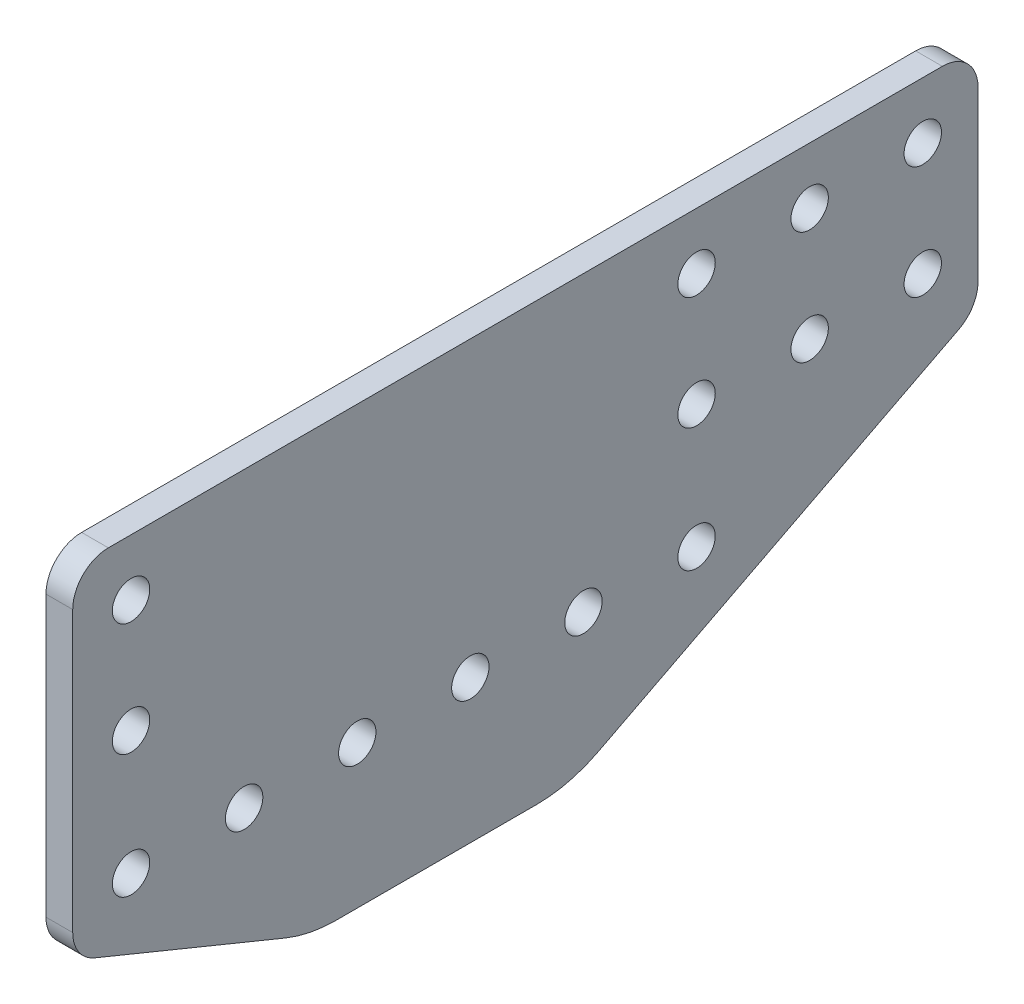
ISO-10303-21;
HEADER;
FILE_DESCRIPTION(('STEP AP214'),'2;1');
FILE_NAME('part.step','',(''),(''),'','','');
FILE_SCHEMA(('AUTOMOTIVE_DESIGN { 1 0 10303 214 1 1 1 1 }'));
ENDSEC;
DATA;
#1=APPLICATION_CONTEXT('core data for automotive mechanical design processes');
#2=APPLICATION_PROTOCOL_DEFINITION('international standard','automotive_design',2000,#1);
#3=PRODUCT_CONTEXT('',#1,'mechanical');
#4=PRODUCT('Part','Part','',(#3));
#5=PRODUCT_RELATED_PRODUCT_CATEGORY('part','',(#4));
#6=PRODUCT_DEFINITION_FORMATION('','',#4);
#7=PRODUCT_DEFINITION_CONTEXT('part definition',#1,'design');
#8=PRODUCT_DEFINITION('design','',#6,#7);
#9=PRODUCT_DEFINITION_SHAPE('','',#8);
#10=(LENGTH_UNIT() NAMED_UNIT(*) SI_UNIT(.MILLI.,.METRE.));
#11=(NAMED_UNIT(*) PLANE_ANGLE_UNIT() SI_UNIT($,.RADIAN.));
#12=(NAMED_UNIT(*) SI_UNIT($,.STERADIAN.) SOLID_ANGLE_UNIT());
#13=UNCERTAINTY_MEASURE_WITH_UNIT(LENGTH_MEASURE(1.E-05),#10,'distance_accuracy_value','');
#14=(GEOMETRIC_REPRESENTATION_CONTEXT(3) GLOBAL_UNCERTAINTY_ASSIGNED_CONTEXT((#13)) GLOBAL_UNIT_ASSIGNED_CONTEXT((#10,
#11,#12)) REPRESENTATION_CONTEXT('',''));
#15=CARTESIAN_POINT('',(0.,0.,0.));
#16=DIRECTION('',(0.,0.,1.));
#17=DIRECTION('',(1.,0.,0.));
#18=AXIS2_PLACEMENT_3D('',#15,#16,#17);
#19=CARTESIAN_POINT('',(3.,44.1852219844326,38.1241040048911));
#20=DIRECTION('',(-1.,0.,0.));
#21=DIRECTION('',(0.,0.,1.));
#22=AXIS2_PLACEMENT_3D('',#19,#20,#21);
#23=CYLINDRICAL_SURFACE('',#22,4.);
#24=CARTESIAN_POINT('',(0.,44.1852219844326,38.1241040048911));
#25=DIRECTION('',(1.,0.,0.));
#26=DIRECTION('',(0.,0.,-1.));
#27=AXIS2_PLACEMENT_3D('',#24,#25,#26);
#28=CIRCLE('',#27,4.);
#29=CARTESIAN_POINT('',(0.,44.1852219844325,42.1241040048911));
#30=VERTEX_POINT('',#29);
#31=CARTESIAN_POINT('',(0.,48.1852219844326,38.1241040048911));
#32=VERTEX_POINT('',#31);
#33=EDGE_CURVE('E202',#30,#32,#28,.F.);
#34=ORIENTED_EDGE('',*,*,#33,.F.);
#35=DIRECTION('',(-1.,0.,0.));
#36=VECTOR('',#35,1.);
#37=CARTESIAN_POINT('',(3.,44.1852219844325,42.1241040048911));
#38=LINE('',#37,#36);
#39=CARTESIAN_POINT('',(3.,44.1852219844325,42.1241040048911));
#40=VERTEX_POINT('',#39);
#41=EDGE_CURVE('E11',#40,#30,#38,.T.);
#42=ORIENTED_EDGE('',*,*,#41,.F.);
#43=CARTESIAN_POINT('',(3.,44.1852219844326,38.1241040048911));
#44=DIRECTION('',(1.,0.,0.));
#45=DIRECTION('',(0.,0.,-1.));
#46=AXIS2_PLACEMENT_3D('',#43,#44,#45);
#47=CIRCLE('',#46,4.);
#48=CARTESIAN_POINT('',(3.,48.1852219844326,38.1241040048911));
#49=VERTEX_POINT('',#48);
#50=EDGE_CURVE('E311',#40,#49,#47,.F.);
#51=ORIENTED_EDGE('',*,*,#50,.T.);
#52=DIRECTION('',(-1.,0.,0.));
#53=VECTOR('',#52,1.);
#54=CARTESIAN_POINT('',(3.,48.1852219844326,38.1241040048911));
#55=LINE('',#54,#53);
#56=EDGE_CURVE('E58',#49,#32,#55,.T.);
#57=ORIENTED_EDGE('',*,*,#56,.T.);
#58=EDGE_LOOP('',(#34,#42,#51,#57));
#59=FACE_BOUND('',#58,.T.);
#60=ADVANCED_FACE('F41',(#59),#23,.T.);
#61=CARTESIAN_POINT('',(3.,0.,42.1241040048911));
#62=DIRECTION('',(0.,0.,1.));
#63=DIRECTION('',(1.,0.,0.));
#64=AXIS2_PLACEMENT_3D('',#61,#62,#63);
#65=PLANE('',#64);
#66=DIRECTION('',(0.,1.,0.));
#67=VECTOR('',#66,1.);
#68=CARTESIAN_POINT('',(0.,0.,42.1241040048911));
#69=LINE('',#68,#67);
#70=CARTESIAN_POINT('',(0.,12.7690313124669,42.1241040048911));
#71=VERTEX_POINT('',#70);
#72=EDGE_CURVE('E204',#71,#30,#69,.T.);
#73=ORIENTED_EDGE('',*,*,#72,.F.);
#74=DIRECTION('',(-1.,0.,0.));
#75=VECTOR('',#74,1.);
#76=CARTESIAN_POINT('',(3.,12.7690313124669,42.1241040048911));
#77=LINE('',#76,#75);
#78=CARTESIAN_POINT('',(3.,12.7690313124669,42.1241040048911));
#79=VERTEX_POINT('',#78);
#80=EDGE_CURVE('E50',#79,#71,#77,.T.);
#81=ORIENTED_EDGE('',*,*,#80,.F.);
#82=DIRECTION('',(0.,1.,0.));
#83=VECTOR('',#82,1.);
#84=CARTESIAN_POINT('',(3.,0.,42.1241040048911));
#85=LINE('',#84,#83);
#86=EDGE_CURVE('E309',#79,#40,#85,.T.);
#87=ORIENTED_EDGE('',*,*,#86,.T.);
#88=ORIENTED_EDGE('',*,*,#41,.T.);
#89=EDGE_LOOP('',(#73,#81,#87,#88));
#90=FACE_BOUND('',#89,.T.);
#91=ADVANCED_FACE('F296',(#90),#65,.T.);
#92=CARTESIAN_POINT('',(3.,12.7690313124668,38.1241040048911));
#93=DIRECTION('',(-1.,0.,0.));
#94=DIRECTION('',(0.,0.,1.));
#95=AXIS2_PLACEMENT_3D('',#92,#93,#94);
#96=CYLINDRICAL_SURFACE('',#95,4.);
#97=CARTESIAN_POINT('',(0.,12.7690313124668,38.1241040048911));
#98=DIRECTION('',(1.,0.,0.));
#99=DIRECTION('',(0.,0.,-1.));
#100=AXIS2_PLACEMENT_3D('',#97,#98,#99);
#101=CIRCLE('',#100,4.);
#102=CARTESIAN_POINT('',(0.,9.06767724441792,39.6406718612489));
#103=VERTEX_POINT('',#102);
#104=EDGE_CURVE('E207',#103,#71,#101,.F.);
#105=ORIENTED_EDGE('',*,*,#104,.F.);
#106=DIRECTION('',(-1.,0.,0.));
#107=VECTOR('',#106,1.);
#108=CARTESIAN_POINT('',(3.,9.06767724441792,39.6406718612489));
#109=LINE('',#108,#107);
#110=CARTESIAN_POINT('',(3.,9.06767724441792,39.6406718612489));
#111=VERTEX_POINT('',#110);
#112=EDGE_CURVE('E285',#111,#103,#109,.T.);
#113=ORIENTED_EDGE('',*,*,#112,.F.);
#114=CARTESIAN_POINT('',(3.,12.7690313124668,38.1241040048911));
#115=DIRECTION('',(1.,0.,0.));
#116=DIRECTION('',(0.,0.,-1.));
#117=AXIS2_PLACEMENT_3D('',#114,#115,#116);
#118=CIRCLE('',#117,4.);
#119=EDGE_CURVE('E292',#111,#79,#118,.F.);
#120=ORIENTED_EDGE('',*,*,#119,.T.);
#121=ORIENTED_EDGE('',*,*,#80,.T.);
#122=EDGE_LOOP('',(#105,#113,#120,#121));
#123=FACE_BOUND('',#122,.T.);
#124=ADVANCED_FACE('F290',(#123),#96,.T.);
#125=CARTESIAN_POINT('',(3.,-6.14311067219644,2.51703674174916));
#126=DIRECTION('',(0.,0.925338517012228,-0.379141964089456));
#127=DIRECTION('',(0.,0.379141964089456,0.925338517012228));
#128=AXIS2_PLACEMENT_3D('',#125,#126,#127);
#129=PLANE('',#128);
#130=DIRECTION('',(0.,-0.379141964089456,-0.925338517012228));
#131=VECTOR('',#130,1.);
#132=CARTESIAN_POINT('',(0.,-6.14311067219644,2.51703674174916));
#133=LINE('',#132,#131);
#134=CARTESIAN_POINT('',(0.,0.295245494697373,18.2305675870564));
#135=VERTEX_POINT('',#134);
#136=EDGE_CURVE('E210',#103,#135,#133,.T.);
#137=ORIENTED_EDGE('',*,*,#136,.T.);
#138=DIRECTION('',(-1.,0.,0.));
#139=VECTOR('',#138,1.);
#140=CARTESIAN_POINT('',(3.,0.295245494697373,18.2305675870564));
#141=LINE('',#140,#139);
#142=CARTESIAN_POINT('',(3.,0.295245494697373,18.2305675870564));
#143=VERTEX_POINT('',#142);
#144=EDGE_CURVE('E282',#143,#135,#141,.T.);
#145=ORIENTED_EDGE('',*,*,#144,.F.);
#146=DIRECTION('',(0.,-0.379141964089456,-0.925338517012228));
#147=VECTOR('',#146,1.);
#148=CARTESIAN_POINT('',(3.,-6.14311067219644,2.51703674174916));
#149=LINE('',#148,#147);
#150=EDGE_CURVE('E306',#111,#143,#149,.T.);
#151=ORIENTED_EDGE('',*,*,#150,.F.);
#152=ORIENTED_EDGE('',*,*,#112,.T.);
#153=EDGE_LOOP('',(#137,#145,#151,#152));
#154=FACE_BOUND('',#153,.T.);
#155=ADVANCED_FACE('F303',(#154),#129,.F.);
#156=CARTESIAN_POINT('',(3.,14.1753232498808,12.5434381257146));
#157=DIRECTION('',(-1.,0.,0.));
#158=DIRECTION('',(0.,0.,1.));
#159=AXIS2_PLACEMENT_3D('',#156,#157,#158);
#160=CYLINDRICAL_SURFACE('',#159,15.);
#161=CARTESIAN_POINT('',(0.,14.1753232498808,12.5434381257146));
#162=DIRECTION('',(1.,0.,0.));
#163=DIRECTION('',(0.,0.,-1.));
#164=AXIS2_PLACEMENT_3D('',#161,#162,#163);
#165=CIRCLE('',#164,15.);
#166=CARTESIAN_POINT('',(0.,-0.82467675011922,12.5434381257146));
#167=VERTEX_POINT('',#166);
#168=EDGE_CURVE('E213',#135,#167,#165,.T.);
#169=ORIENTED_EDGE('',*,*,#168,.T.);
#170=DIRECTION('',(-1.,0.,0.));
#171=VECTOR('',#170,1.);
#172=CARTESIAN_POINT('',(3.,-0.82467675011922,12.5434381257146));
#173=LINE('',#172,#171);
#174=CARTESIAN_POINT('',(3.,-0.82467675011922,12.5434381257146));
#175=VERTEX_POINT('',#174);
#176=EDGE_CURVE('E280',#175,#167,#173,.T.);
#177=ORIENTED_EDGE('',*,*,#176,.F.);
#178=CARTESIAN_POINT('',(3.,14.1753232498808,12.5434381257146));
#179=DIRECTION('',(1.,0.,0.));
#180=DIRECTION('',(0.,0.,-1.));
#181=AXIS2_PLACEMENT_3D('',#178,#179,#180);
#182=CIRCLE('',#181,15.);
#183=EDGE_CURVE('E307',#143,#175,#182,.T.);
#184=ORIENTED_EDGE('',*,*,#183,.F.);
#185=ORIENTED_EDGE('',*,*,#144,.T.);
#186=EDGE_LOOP('',(#169,#177,#184,#185));
#187=FACE_BOUND('',#186,.T.);
#188=ADVANCED_FACE('F352',(#187),#160,.T.);
#189=CARTESIAN_POINT('',(3.,-0.824676750119212,0.));
#190=DIRECTION('',(0.,-1.,0.));
#191=DIRECTION('',(0.,0.,-1.));
#192=AXIS2_PLACEMENT_3D('',#189,#190,#191);
#193=PLANE('',#192);
#194=DIRECTION('',(0.,0.,1.));
#195=VECTOR('',#194,1.);
#196=CARTESIAN_POINT('',(0.,-0.824676750119212,0.));
#197=LINE('',#196,#195);
#198=CARTESIAN_POINT('',(0.,-0.824676750119206,-9.98443666930804));
#199=VERTEX_POINT('',#198);
#200=EDGE_CURVE('E216',#199,#167,#197,.T.);
#201=ORIENTED_EDGE('',*,*,#200,.F.);
#202=DIRECTION('',(-1.,0.,0.));
#203=VECTOR('',#202,1.);
#204=CARTESIAN_POINT('',(3.,-0.824676750119206,-9.98443666930804));
#205=LINE('',#204,#203);
#206=CARTESIAN_POINT('',(3.,-0.824676750119206,-9.98443666930804));
#207=VERTEX_POINT('',#206);
#208=EDGE_CURVE('E278',#207,#199,#205,.T.);
#209=ORIENTED_EDGE('',*,*,#208,.F.);
#210=DIRECTION('',(0.,0.,1.));
#211=VECTOR('',#210,1.);
#212=CARTESIAN_POINT('',(3.,-0.824676750119212,0.));
#213=LINE('',#212,#211);
#214=EDGE_CURVE('E316',#207,#175,#213,.T.);
#215=ORIENTED_EDGE('',*,*,#214,.T.);
#216=ORIENTED_EDGE('',*,*,#176,.T.);
#217=EDGE_LOOP('',(#201,#209,#215,#216));
#218=FACE_BOUND('',#217,.T.);
#219=ADVANCED_FACE('F355',(#218),#193,.T.);
#220=CARTESIAN_POINT('',(3.,14.1753232498808,-9.98443666930804));
#221=DIRECTION('',(-1.,0.,0.));
#222=DIRECTION('',(0.,0.,1.));
#223=AXIS2_PLACEMENT_3D('',#220,#221,#222);
#224=CYLINDRICAL_SURFACE('',#223,15.);
#225=CARTESIAN_POINT('',(0.,14.1753232498808,-9.98443666930804));
#226=DIRECTION('',(1.,0.,0.));
#227=DIRECTION('',(0.,0.,-1.));
#228=AXIS2_PLACEMENT_3D('',#225,#226,#227);
#229=CIRCLE('',#228,15.);
#230=CARTESIAN_POINT('',(0.,0.835622672016802,-16.8439110291213));
#231=VERTEX_POINT('',#230);
#232=EDGE_CURVE('E219',#199,#231,#229,.T.);
#233=ORIENTED_EDGE('',*,*,#232,.T.);
#234=DIRECTION('',(-1.,0.,0.));
#235=VECTOR('',#234,1.);
#236=CARTESIAN_POINT('',(3.,0.835622672016802,-16.8439110291213));
#237=LINE('',#236,#235);
#238=CARTESIAN_POINT('',(3.,0.835622672016802,-16.8439110291213));
#239=VERTEX_POINT('',#238);
#240=EDGE_CURVE('E276',#239,#231,#237,.T.);
#241=ORIENTED_EDGE('',*,*,#240,.F.);
#242=CARTESIAN_POINT('',(3.,14.1753232498808,-9.98443666930804));
#243=DIRECTION('',(1.,0.,0.));
#244=DIRECTION('',(0.,0.,-1.));
#245=AXIS2_PLACEMENT_3D('',#242,#243,#244);
#246=CIRCLE('',#245,15.);
#247=EDGE_CURVE('E319',#207,#239,#246,.T.);
#248=ORIENTED_EDGE('',*,*,#247,.F.);
#249=ORIENTED_EDGE('',*,*,#208,.T.);
#250=EDGE_LOOP('',(#233,#241,#248,#249));
#251=FACE_BOUND('',#250,.T.);
#252=ADVANCED_FACE('F359',(#251),#224,.T.);
#253=CARTESIAN_POINT('',(3.,-6.18923093124115,-3.18259548870696));
#254=DIRECTION('',(0.,-0.889313371857599,-0.457298290654215));
#255=DIRECTION('',(0.,0.457298290654215,-0.8893133718576));
#256=AXIS2_PLACEMENT_3D('',#253,#254,#255);
#257=PLANE('',#256);
#258=DIRECTION('',(0.,-0.457298290654215,0.8893133718576));
#259=VECTOR('',#258,1.);
#260=CARTESIAN_POINT('',(0.,-6.18923093124115,-3.18259548870696));
#261=LINE('',#260,#259);
#262=CARTESIAN_POINT('',(0.,21.6689605094785,-57.3587484950041));
#263=VERTEX_POINT('',#262);
#264=EDGE_CURVE('E222',#263,#231,#261,.T.);
#265=ORIENTED_EDGE('',*,*,#264,.F.);
#266=DIRECTION('',(-1.,0.,0.));
#267=VECTOR('',#266,1.);
#268=CARTESIAN_POINT('',(3.,21.6689605094785,-57.3587484950041));
#269=LINE('',#268,#267);
#270=CARTESIAN_POINT('',(3.,21.6689605094785,-57.3587484950041));
#271=VERTEX_POINT('',#270);
#272=EDGE_CURVE('E274',#271,#263,#269,.T.);
#273=ORIENTED_EDGE('',*,*,#272,.F.);
#274=DIRECTION('',(0.,-0.457298290654215,0.8893133718576));
#275=VECTOR('',#274,1.);
#276=CARTESIAN_POINT('',(3.,-6.18923093124115,-3.18259548870696));
#277=LINE('',#276,#275);
#278=EDGE_CURVE('E321',#271,#239,#277,.T.);
#279=ORIENTED_EDGE('',*,*,#278,.T.);
#280=ORIENTED_EDGE('',*,*,#240,.T.);
#281=EDGE_LOOP('',(#265,#273,#279,#280));
#282=FACE_BOUND('',#281,.T.);
#283=ADVANCED_FACE('F363',(#282),#257,.T.);
#284=CARTESIAN_POINT('',(3.,25.2262139969089,-55.5295553323872));
#285=DIRECTION('',(-1.,0.,0.));
#286=DIRECTION('',(0.,0.,1.));
#287=AXIS2_PLACEMENT_3D('',#284,#285,#286);
#288=CYLINDRICAL_SURFACE('',#287,4.);
#289=CARTESIAN_POINT('',(0.,25.2262139969089,-55.5295553323872));
#290=DIRECTION('',(1.,0.,0.));
#291=DIRECTION('',(0.,0.,-1.));
#292=AXIS2_PLACEMENT_3D('',#289,#290,#291);
#293=CIRCLE('',#292,4.);
#294=CARTESIAN_POINT('',(0.,25.2262139969089,-59.5295553323872));
#295=VERTEX_POINT('',#294);
#296=EDGE_CURVE('E225',#295,#263,#293,.F.);
#297=ORIENTED_EDGE('',*,*,#296,.F.);
#298=DIRECTION('',(-1.,0.,0.));
#299=VECTOR('',#298,1.);
#300=CARTESIAN_POINT('',(3.,25.2262139969089,-59.5295553323872));
#301=LINE('',#300,#299);
#302=CARTESIAN_POINT('',(3.,25.2262139969089,-59.5295553323872));
#303=VERTEX_POINT('',#302);
#304=EDGE_CURVE('E141',#303,#295,#301,.T.);
#305=ORIENTED_EDGE('',*,*,#304,.F.);
#306=CARTESIAN_POINT('',(3.,25.2262139969089,-55.5295553323872));
#307=DIRECTION('',(1.,0.,0.));
#308=DIRECTION('',(0.,0.,-1.));
#309=AXIS2_PLACEMENT_3D('',#306,#307,#308);
#310=CIRCLE('',#309,4.);
#311=EDGE_CURVE('E152',#303,#271,#310,.F.);
#312=ORIENTED_EDGE('',*,*,#311,.T.);
#313=ORIENTED_EDGE('',*,*,#272,.T.);
#314=EDGE_LOOP('',(#297,#305,#312,#313));
#315=FACE_BOUND('',#314,.T.);
#316=ADVANCED_FACE('F325',(#315),#288,.T.);
#317=CARTESIAN_POINT('',(3.,0.,-59.5295553323872));
#318=DIRECTION('',(0.,0.,-1.));
#319=DIRECTION('',(0.,1.,0.));
#320=AXIS2_PLACEMENT_3D('',#317,#318,#319);
#321=PLANE('',#320);
#322=DIRECTION('',(0.,-1.,0.));
#323=VECTOR('',#322,1.);
#324=CARTESIAN_POINT('',(0.,0.,-59.5295553323872));
#325=LINE('',#324,#323);
#326=CARTESIAN_POINT('',(0.,44.1852219844325,-59.5295553323872));
#327=VERTEX_POINT('',#326);
#328=EDGE_CURVE('E137',#327,#295,#325,.T.);
#329=ORIENTED_EDGE('',*,*,#328,.F.);
#330=DIRECTION('',(-1.,0.,0.));
#331=VECTOR('',#330,1.);
#332=CARTESIAN_POINT('',(3.,44.1852219844325,-59.5295553323872));
#333=LINE('',#332,#331);
#334=CARTESIAN_POINT('',(3.,44.1852219844325,-59.5295553323872));
#335=VERTEX_POINT('',#334);
#336=EDGE_CURVE('E132',#335,#327,#333,.T.);
#337=ORIENTED_EDGE('',*,*,#336,.F.);
#338=DIRECTION('',(0.,-1.,0.));
#339=VECTOR('',#338,1.);
#340=CARTESIAN_POINT('',(3.,0.,-59.5295553323872));
#341=LINE('',#340,#339);
#342=EDGE_CURVE('E135',#335,#303,#341,.T.);
#343=ORIENTED_EDGE('',*,*,#342,.T.);
#344=ORIENTED_EDGE('',*,*,#304,.T.);
#345=EDGE_LOOP('',(#329,#337,#343,#344));
#346=FACE_BOUND('',#345,.T.);
#347=ADVANCED_FACE('F134',(#346),#321,.T.);
#348=CARTESIAN_POINT('',(3.,44.1852219844326,-55.5295553323872));
#349=DIRECTION('',(-1.,0.,0.));
#350=DIRECTION('',(0.,0.,1.));
#351=AXIS2_PLACEMENT_3D('',#348,#349,#350);
#352=CYLINDRICAL_SURFACE('',#351,4.);
#353=CARTESIAN_POINT('',(0.,44.1852219844326,-55.5295553323872));
#354=DIRECTION('',(1.,0.,0.));
#355=DIRECTION('',(0.,0.,-1.));
#356=AXIS2_PLACEMENT_3D('',#353,#354,#355);
#357=CIRCLE('',#356,4.);
#358=CARTESIAN_POINT('',(0.,48.1852219844326,-55.5295553323872));
#359=VERTEX_POINT('',#358);
#360=EDGE_CURVE('E229',#359,#327,#357,.F.);
#361=ORIENTED_EDGE('',*,*,#360,.F.);
#362=DIRECTION('',(-1.,0.,0.));
#363=VECTOR('',#362,1.);
#364=CARTESIAN_POINT('',(3.,48.1852219844326,-55.5295553323872));
#365=LINE('',#364,#363);
#366=CARTESIAN_POINT('',(3.,48.1852219844326,-55.5295553323872));
#367=VERTEX_POINT('',#366);
#368=EDGE_CURVE('E95',#367,#359,#365,.T.);
#369=ORIENTED_EDGE('',*,*,#368,.F.);
#370=CARTESIAN_POINT('',(3.,44.1852219844326,-55.5295553323872));
#371=DIRECTION('',(1.,0.,0.));
#372=DIRECTION('',(0.,0.,-1.));
#373=AXIS2_PLACEMENT_3D('',#370,#371,#372);
#374=CIRCLE('',#373,4.);
#375=EDGE_CURVE('E149',#367,#335,#374,.F.);
#376=ORIENTED_EDGE('',*,*,#375,.T.);
#377=ORIENTED_EDGE('',*,*,#336,.T.);
#378=EDGE_LOOP('',(#361,#369,#376,#377));
#379=FACE_BOUND('',#378,.T.);
#380=ADVANCED_FACE('F154',(#379),#352,.T.);
#381=CARTESIAN_POINT('',(3.,15.2668219843309,35.5739980582187));
#382=DIRECTION('',(-1.,0.,0.));
#383=DIRECTION('',(0.,0.,1.));
#384=AXIS2_PLACEMENT_3D('',#381,#382,#383);
#385=CYLINDRICAL_SURFACE('',#384,2.09999999999999);
#386=CARTESIAN_POINT('',(3.,15.2668219843309,35.5739980582187));
#387=DIRECTION('',(1.,0.,0.));
#388=DIRECTION('',(0.,0.,-1.));
#389=AXIS2_PLACEMENT_3D('',#386,#387,#388);
#390=CIRCLE('',#389,2.09999999999999);
#391=CARTESIAN_POINT('',(3.,15.2668219843309,33.4739980582187));
#392=VERTEX_POINT('',#391);
#393=EDGE_CURVE('E190',#392,#392,#390,.T.);
#394=ORIENTED_EDGE('',*,*,#393,.T.);
#395=EDGE_LOOP('',(#394));
#396=FACE_BOUND('',#395,.T.);
#397=CARTESIAN_POINT('',(0.,15.2668219843309,35.5739980582187));
#398=DIRECTION('',(1.,0.,0.));
#399=DIRECTION('',(0.,0.,-1.));
#400=AXIS2_PLACEMENT_3D('',#397,#398,#399);
#401=CIRCLE('',#400,2.09999999999999);
#402=CARTESIAN_POINT('',(0.,15.2668219843309,33.4739980582187));
#403=VERTEX_POINT('',#402);
#404=EDGE_CURVE('E264',#403,#403,#401,.T.);
#405=ORIENTED_EDGE('',*,*,#404,.F.);
#406=EDGE_LOOP('',(#405));
#407=FACE_BOUND('',#406,.T.);
#408=ADVANCED_FACE('F372',(#396,#407),#385,.F.);
#409=CARTESIAN_POINT('',(3.,15.2668219843309,22.8739980582187));
#410=DIRECTION('',(-1.,0.,0.));
#411=DIRECTION('',(0.,0.,1.));
#412=AXIS2_PLACEMENT_3D('',#409,#410,#411);
#413=CYLINDRICAL_SURFACE('',#412,2.09999999999999);
#414=CARTESIAN_POINT('',(3.,15.2668219843309,22.8739980582187));
#415=DIRECTION('',(1.,0.,0.));
#416=DIRECTION('',(0.,0.,-1.));
#417=AXIS2_PLACEMENT_3D('',#414,#415,#416);
#418=CIRCLE('',#417,2.09999999999999);
#419=CARTESIAN_POINT('',(3.,15.2668219843309,20.7739980582188));
#420=VERTEX_POINT('',#419);
#421=EDGE_CURVE('E187',#420,#420,#418,.T.);
#422=ORIENTED_EDGE('',*,*,#421,.T.);
#423=EDGE_LOOP('',(#422));
#424=FACE_BOUND('',#423,.T.);
#425=CARTESIAN_POINT('',(0.,15.2668219843309,22.8739980582187));
#426=DIRECTION('',(1.,0.,0.));
#427=DIRECTION('',(0.,0.,-1.));
#428=AXIS2_PLACEMENT_3D('',#425,#426,#427);
#429=CIRCLE('',#428,2.09999999999999);
#430=CARTESIAN_POINT('',(0.,15.2668219843309,20.7739980582188));
#431=VERTEX_POINT('',#430);
#432=EDGE_CURVE('E261',#431,#431,#429,.T.);
#433=ORIENTED_EDGE('',*,*,#432,.F.);
#434=EDGE_LOOP('',(#433));
#435=FACE_BOUND('',#434,.T.);
#436=ADVANCED_FACE('F376',(#424,#435),#413,.F.);
#437=CARTESIAN_POINT('',(3.,15.2668219843309,10.1739980582187));
#438=DIRECTION('',(-1.,0.,0.));
#439=DIRECTION('',(0.,0.,1.));
#440=AXIS2_PLACEMENT_3D('',#437,#438,#439);
#441=CYLINDRICAL_SURFACE('',#440,2.09999999999999);
#442=CARTESIAN_POINT('',(3.,15.2668219843309,10.1739980582187));
#443=DIRECTION('',(1.,0.,0.));
#444=DIRECTION('',(0.,0.,-1.));
#445=AXIS2_PLACEMENT_3D('',#442,#443,#444);
#446=CIRCLE('',#445,2.09999999999999);
#447=CARTESIAN_POINT('',(3.,15.2668219843309,8.07399805821873));
#448=VERTEX_POINT('',#447);
#449=EDGE_CURVE('E184',#448,#448,#446,.T.);
#450=ORIENTED_EDGE('',*,*,#449,.T.);
#451=EDGE_LOOP('',(#450));
#452=FACE_BOUND('',#451,.T.);
#453=CARTESIAN_POINT('',(0.,15.2668219843309,10.1739980582187));
#454=DIRECTION('',(1.,0.,0.));
#455=DIRECTION('',(0.,0.,-1.));
#456=AXIS2_PLACEMENT_3D('',#453,#454,#455);
#457=CIRCLE('',#456,2.09999999999999);
#458=CARTESIAN_POINT('',(0.,15.2668219843309,8.07399805821873));
#459=VERTEX_POINT('',#458);
#460=EDGE_CURVE('E258',#459,#459,#457,.T.);
#461=ORIENTED_EDGE('',*,*,#460,.F.);
#462=EDGE_LOOP('',(#461));
#463=FACE_BOUND('',#462,.T.);
#464=ADVANCED_FACE('F382',(#452,#463),#441,.F.);
#465=CARTESIAN_POINT('',(3.,15.2668219843309,-2.52600194178126));
#466=DIRECTION('',(-1.,0.,0.));
#467=DIRECTION('',(0.,0.,1.));
#468=AXIS2_PLACEMENT_3D('',#465,#466,#467);
#469=CYLINDRICAL_SURFACE('',#468,2.09999999999999);
#470=CARTESIAN_POINT('',(3.,15.2668219843309,-2.52600194178126));
#471=DIRECTION('',(1.,0.,0.));
#472=DIRECTION('',(0.,0.,-1.));
#473=AXIS2_PLACEMENT_3D('',#470,#471,#472);
#474=CIRCLE('',#473,2.09999999999999);
#475=CARTESIAN_POINT('',(3.,15.2668219843309,-4.62600194178125));
#476=VERTEX_POINT('',#475);
#477=EDGE_CURVE('E181',#476,#476,#474,.T.);
#478=ORIENTED_EDGE('',*,*,#477,.T.);
#479=EDGE_LOOP('',(#478));
#480=FACE_BOUND('',#479,.T.);
#481=CARTESIAN_POINT('',(0.,15.2668219843309,-2.52600194178126));
#482=DIRECTION('',(1.,0.,0.));
#483=DIRECTION('',(0.,0.,-1.));
#484=AXIS2_PLACEMENT_3D('',#481,#482,#483);
#485=CIRCLE('',#484,2.09999999999999);
#486=CARTESIAN_POINT('',(0.,15.2668219843309,-4.62600194178125));
#487=VERTEX_POINT('',#486);
#488=EDGE_CURVE('E255',#487,#487,#485,.T.);
#489=ORIENTED_EDGE('',*,*,#488,.F.);
#490=EDGE_LOOP('',(#489));
#491=FACE_BOUND('',#490,.T.);
#492=ADVANCED_FACE('F392',(#480,#491),#469,.F.);
#493=CARTESIAN_POINT('',(3.,15.2668219843309,-15.2260019417813));
#494=DIRECTION('',(-1.,0.,0.));
#495=DIRECTION('',(0.,0.,1.));
#496=AXIS2_PLACEMENT_3D('',#493,#494,#495);
#497=CYLINDRICAL_SURFACE('',#496,2.09999999999999);
#498=CARTESIAN_POINT('',(3.,15.2668219843309,-15.2260019417813));
#499=DIRECTION('',(1.,0.,0.));
#500=DIRECTION('',(0.,0.,-1.));
#501=AXIS2_PLACEMENT_3D('',#498,#499,#500);
#502=CIRCLE('',#501,2.09999999999999);
#503=CARTESIAN_POINT('',(3.,15.2668219843309,-17.3260019417813));
#504=VERTEX_POINT('',#503);
#505=EDGE_CURVE('E178',#504,#504,#502,.T.);
#506=ORIENTED_EDGE('',*,*,#505,.T.);
#507=EDGE_LOOP('',(#506));
#508=FACE_BOUND('',#507,.T.);
#509=CARTESIAN_POINT('',(0.,15.2668219843309,-15.2260019417813));
#510=DIRECTION('',(1.,0.,0.));
#511=DIRECTION('',(0.,0.,-1.));
#512=AXIS2_PLACEMENT_3D('',#509,#510,#511);
#513=CIRCLE('',#512,2.09999999999999);
#514=CARTESIAN_POINT('',(0.,15.2668219843309,-17.3260019417813));
#515=VERTEX_POINT('',#514);
#516=EDGE_CURVE('E252',#515,#515,#513,.T.);
#517=ORIENTED_EDGE('',*,*,#516,.F.);
#518=EDGE_LOOP('',(#517));
#519=FACE_BOUND('',#518,.T.);
#520=ADVANCED_FACE('F396',(#508,#519),#497,.F.);
#521=CARTESIAN_POINT('',(3.,15.2668219843309,-27.9260019417813));
#522=DIRECTION('',(-1.,0.,0.));
#523=DIRECTION('',(0.,0.,1.));
#524=AXIS2_PLACEMENT_3D('',#521,#522,#523);
#525=CYLINDRICAL_SURFACE('',#524,2.09999999999999);
#526=CARTESIAN_POINT('',(3.,15.2668219843309,-27.9260019417813));
#527=DIRECTION('',(1.,0.,0.));
#528=DIRECTION('',(0.,0.,-1.));
#529=AXIS2_PLACEMENT_3D('',#526,#527,#528);
#530=CIRCLE('',#529,2.09999999999999);
#531=CARTESIAN_POINT('',(3.,15.2668219843309,-30.0260019417813));
#532=VERTEX_POINT('',#531);
#533=EDGE_CURVE('E175',#532,#532,#530,.T.);
#534=ORIENTED_EDGE('',*,*,#533,.T.);
#535=EDGE_LOOP('',(#534));
#536=FACE_BOUND('',#535,.T.);
#537=CARTESIAN_POINT('',(0.,15.2668219843309,-27.9260019417813));
#538=DIRECTION('',(1.,0.,0.));
#539=DIRECTION('',(0.,0.,-1.));
#540=AXIS2_PLACEMENT_3D('',#537,#538,#539);
#541=CIRCLE('',#540,2.09999999999999);
#542=CARTESIAN_POINT('',(0.,15.2668219843309,-30.0260019417813));
#543=VERTEX_POINT('',#542);
#544=EDGE_CURVE('E249',#543,#543,#541,.T.);
#545=ORIENTED_EDGE('',*,*,#544,.F.);
#546=EDGE_LOOP('',(#545));
#547=FACE_BOUND('',#546,.T.);
#548=ADVANCED_FACE('F400',(#536,#547),#525,.F.);
#549=CARTESIAN_POINT('',(3.,41.8352219843575,-53.3260019417939));
#550=DIRECTION('',(-1.,0.,0.));
#551=DIRECTION('',(0.,0.,1.));
#552=AXIS2_PLACEMENT_3D('',#549,#550,#551);
#553=CYLINDRICAL_SURFACE('',#552,2.1);
#554=CARTESIAN_POINT('',(3.,41.8352219843575,-53.3260019417939));
#555=DIRECTION('',(1.,0.,0.));
#556=DIRECTION('',(0.,0.,-1.));
#557=AXIS2_PLACEMENT_3D('',#554,#555,#556);
#558=CIRCLE('',#557,2.1);
#559=CARTESIAN_POINT('',(3.,41.8352219843575,-55.4260019417939));
#560=VERTEX_POINT('',#559);
#561=EDGE_CURVE('E172',#560,#560,#558,.T.);
#562=ORIENTED_EDGE('',*,*,#561,.T.);
#563=EDGE_LOOP('',(#562));
#564=FACE_BOUND('',#563,.T.);
#565=CARTESIAN_POINT('',(0.,41.8352219843575,-53.3260019417939));
#566=DIRECTION('',(1.,0.,0.));
#567=DIRECTION('',(0.,0.,-1.));
#568=AXIS2_PLACEMENT_3D('',#565,#566,#567);
#569=CIRCLE('',#568,2.1);
#570=CARTESIAN_POINT('',(0.,41.8352219843575,-55.4260019417939));
#571=VERTEX_POINT('',#570);
#572=EDGE_CURVE('E246',#571,#571,#569,.T.);
#573=ORIENTED_EDGE('',*,*,#572,.F.);
#574=EDGE_LOOP('',(#573));
#575=FACE_BOUND('',#574,.T.);
#576=ADVANCED_FACE('F404',(#564,#575),#553,.F.);
#577=CARTESIAN_POINT('',(3.,29.1352219843575,-53.326001941794));
#578=DIRECTION('',(-1.,0.,0.));
#579=DIRECTION('',(0.,0.,1.));
#580=AXIS2_PLACEMENT_3D('',#577,#578,#579);
#581=CYLINDRICAL_SURFACE('',#580,2.1);
#582=CARTESIAN_POINT('',(3.,29.1352219843575,-53.326001941794));
#583=DIRECTION('',(1.,0.,0.));
#584=DIRECTION('',(0.,0.,-1.));
#585=AXIS2_PLACEMENT_3D('',#582,#583,#584);
#586=CIRCLE('',#585,2.1);
#587=CARTESIAN_POINT('',(3.,29.1352219843575,-55.426001941794));
#588=VERTEX_POINT('',#587);
#589=EDGE_CURVE('E169',#588,#588,#586,.T.);
#590=ORIENTED_EDGE('',*,*,#589,.T.);
#591=EDGE_LOOP('',(#590));
#592=FACE_BOUND('',#591,.T.);
#593=CARTESIAN_POINT('',(0.,29.1352219843575,-53.326001941794));
#594=DIRECTION('',(1.,0.,0.));
#595=DIRECTION('',(0.,0.,-1.));
#596=AXIS2_PLACEMENT_3D('',#593,#594,#595);
#597=CIRCLE('',#596,2.1);
#598=CARTESIAN_POINT('',(0.,29.1352219843575,-55.426001941794));
#599=VERTEX_POINT('',#598);
#600=EDGE_CURVE('E243',#599,#599,#597,.T.);
#601=ORIENTED_EDGE('',*,*,#600,.F.);
#602=EDGE_LOOP('',(#601));
#603=FACE_BOUND('',#602,.T.);
#604=ADVANCED_FACE('F408',(#592,#603),#581,.F.);
#605=CARTESIAN_POINT('',(3.,29.1352219843575,-40.626001941794));
#606=DIRECTION('',(-1.,0.,0.));
#607=DIRECTION('',(0.,0.,1.));
#608=AXIS2_PLACEMENT_3D('',#605,#606,#607);
#609=CYLINDRICAL_SURFACE('',#608,2.1);
#610=CARTESIAN_POINT('',(3.,29.1352219843575,-40.626001941794));
#611=DIRECTION('',(1.,0.,0.));
#612=DIRECTION('',(0.,0.,-1.));
#613=AXIS2_PLACEMENT_3D('',#610,#611,#612);
#614=CIRCLE('',#613,2.1);
#615=CARTESIAN_POINT('',(3.,29.1352219843575,-42.726001941794));
#616=VERTEX_POINT('',#615);
#617=EDGE_CURVE('E166',#616,#616,#614,.T.);
#618=ORIENTED_EDGE('',*,*,#617,.T.);
#619=EDGE_LOOP('',(#618));
#620=FACE_BOUND('',#619,.T.);
#621=CARTESIAN_POINT('',(0.,29.1352219843575,-40.626001941794));
#622=DIRECTION('',(1.,0.,0.));
#623=DIRECTION('',(0.,0.,-1.));
#624=AXIS2_PLACEMENT_3D('',#621,#622,#623);
#625=CIRCLE('',#624,2.1);
#626=CARTESIAN_POINT('',(0.,29.1352219843575,-42.726001941794));
#627=VERTEX_POINT('',#626);
#628=EDGE_CURVE('E240',#627,#627,#625,.T.);
#629=ORIENTED_EDGE('',*,*,#628,.F.);
#630=EDGE_LOOP('',(#629));
#631=FACE_BOUND('',#630,.T.);
#632=ADVANCED_FACE('F412',(#620,#631),#609,.F.);
#633=CARTESIAN_POINT('',(3.,41.8352219843571,35.5739980582059));
#634=DIRECTION('',(-1.,0.,0.));
#635=DIRECTION('',(0.,0.,1.));
#636=AXIS2_PLACEMENT_3D('',#633,#634,#635);
#637=CYLINDRICAL_SURFACE('',#636,2.09999999999999);
#638=CARTESIAN_POINT('',(3.,41.8352219843571,35.5739980582059));
#639=DIRECTION('',(1.,0.,0.));
#640=DIRECTION('',(0.,0.,-1.));
#641=AXIS2_PLACEMENT_3D('',#638,#639,#640);
#642=CIRCLE('',#641,2.09999999999999);
#643=CARTESIAN_POINT('',(3.,41.8352219843571,33.4739980582059));
#644=VERTEX_POINT('',#643);
#645=EDGE_CURVE('E163',#644,#644,#642,.T.);
#646=ORIENTED_EDGE('',*,*,#645,.T.);
#647=EDGE_LOOP('',(#646));
#648=FACE_BOUND('',#647,.T.);
#649=CARTESIAN_POINT('',(0.,41.8352219843571,35.5739980582059));
#650=DIRECTION('',(1.,0.,0.));
#651=DIRECTION('',(0.,0.,-1.));
#652=AXIS2_PLACEMENT_3D('',#649,#650,#651);
#653=CIRCLE('',#652,2.09999999999999);
#654=CARTESIAN_POINT('',(0.,41.8352219843571,33.4739980582059));
#655=VERTEX_POINT('',#654);
#656=EDGE_CURVE('E237',#655,#655,#653,.T.);
#657=ORIENTED_EDGE('',*,*,#656,.F.);
#658=EDGE_LOOP('',(#657));
#659=FACE_BOUND('',#658,.T.);
#660=ADVANCED_FACE('F337',(#648,#659),#637,.F.);
#661=CARTESIAN_POINT('',(3.,29.1352219843571,35.5739980582057));
#662=DIRECTION('',(-1.,0.,0.));
#663=DIRECTION('',(0.,0.,1.));
#664=AXIS2_PLACEMENT_3D('',#661,#662,#663);
#665=CYLINDRICAL_SURFACE('',#664,2.09999999999999);
#666=CARTESIAN_POINT('',(3.,29.1352219843571,35.5739980582057));
#667=DIRECTION('',(1.,0.,0.));
#668=DIRECTION('',(0.,0.,-1.));
#669=AXIS2_PLACEMENT_3D('',#666,#667,#668);
#670=CIRCLE('',#669,2.09999999999999);
#671=CARTESIAN_POINT('',(3.,29.1352219843571,33.4739980582058));
#672=VERTEX_POINT('',#671);
#673=EDGE_CURVE('E157',#672,#672,#670,.T.);
#674=ORIENTED_EDGE('',*,*,#673,.T.);
#675=EDGE_LOOP('',(#674));
#676=FACE_BOUND('',#675,.T.);
#677=CARTESIAN_POINT('',(0.,29.1352219843571,35.5739980582057));
#678=DIRECTION('',(1.,0.,0.));
#679=DIRECTION('',(0.,0.,-1.));
#680=AXIS2_PLACEMENT_3D('',#677,#678,#679);
#681=CIRCLE('',#680,2.09999999999999);
#682=CARTESIAN_POINT('',(0.,29.1352219843571,33.4739980582058));
#683=VERTEX_POINT('',#682);
#684=EDGE_CURVE('E234',#683,#683,#681,.T.);
#685=ORIENTED_EDGE('',*,*,#684,.F.);
#686=EDGE_LOOP('',(#685));
#687=FACE_BOUND('',#686,.T.);
#688=ADVANCED_FACE('F330',(#676,#687),#665,.F.);
#689=CARTESIAN_POINT('',(3.,48.1852219844326,0.));
#690=DIRECTION('',(0.,1.,0.));
#691=DIRECTION('',(0.,0.,1.));
#692=AXIS2_PLACEMENT_3D('',#689,#690,#691);
#693=PLANE('',#692);
#694=DIRECTION('',(0.,0.,-1.));
#695=VECTOR('',#694,1.);
#696=CARTESIAN_POINT('',(0.,48.1852219844326,0.));
#697=LINE('',#696,#695);
#698=EDGE_CURVE('E231',#32,#359,#697,.T.);
#699=ORIENTED_EDGE('',*,*,#698,.F.);
#700=ORIENTED_EDGE('',*,*,#56,.F.);
#701=DIRECTION('',(0.,0.,-1.));
#702=VECTOR('',#701,1.);
#703=CARTESIAN_POINT('',(3.,48.1852219844326,0.));
#704=LINE('',#703,#702);
#705=EDGE_CURVE('E155',#49,#367,#704,.T.);
#706=ORIENTED_EDGE('',*,*,#705,.T.);
#707=ORIENTED_EDGE('',*,*,#368,.T.);
#708=EDGE_LOOP('',(#699,#700,#706,#707));
#709=FACE_BOUND('',#708,.T.);
#710=ADVANCED_FACE('F327',(#709),#693,.T.);
#711=CARTESIAN_POINT('',(3.,41.8352219843574,-27.9260019417939));
#712=DIRECTION('',(-1.,0.,0.));
#713=DIRECTION('',(0.,0.,1.));
#714=AXIS2_PLACEMENT_3D('',#711,#712,#713);
#715=CYLINDRICAL_SURFACE('',#714,2.1);
#716=CARTESIAN_POINT('',(3.,41.8352219843574,-27.9260019417939));
#717=DIRECTION('',(1.,0.,0.));
#718=DIRECTION('',(0.,0.,-1.));
#719=AXIS2_PLACEMENT_3D('',#716,#717,#718);
#720=CIRCLE('',#719,2.1);
#721=CARTESIAN_POINT('',(3.,41.8352219843574,-30.0260019417939));
#722=VERTEX_POINT('',#721);
#723=EDGE_CURVE('E468',#722,#722,#720,.T.);
#724=ORIENTED_EDGE('',*,*,#723,.T.);
#725=EDGE_LOOP('',(#724));
#726=FACE_BOUND('',#725,.T.);
#727=CARTESIAN_POINT('',(0.,41.8352219843574,-27.9260019417939));
#728=DIRECTION('',(1.,0.,0.));
#729=DIRECTION('',(0.,0.,-1.));
#730=AXIS2_PLACEMENT_3D('',#727,#728,#729);
#731=CIRCLE('',#730,2.1);
#732=CARTESIAN_POINT('',(0.,41.8352219843574,-30.0260019417939));
#733=VERTEX_POINT('',#732);
#734=EDGE_CURVE('E199',#733,#733,#731,.T.);
#735=ORIENTED_EDGE('',*,*,#734,.F.);
#736=EDGE_LOOP('',(#735));
#737=FACE_BOUND('',#736,.T.);
#738=ADVANCED_FACE('F329',(#726,#737),#715,.F.);
#739=CARTESIAN_POINT('',(3.,29.1352219843574,-27.926001941794));
#740=DIRECTION('',(-1.,0.,0.));
#741=DIRECTION('',(0.,0.,1.));
#742=AXIS2_PLACEMENT_3D('',#739,#740,#741);
#743=CYLINDRICAL_SURFACE('',#742,2.1);
#744=CARTESIAN_POINT('',(3.,29.1352219843574,-27.926001941794));
#745=DIRECTION('',(1.,0.,0.));
#746=DIRECTION('',(0.,0.,-1.));
#747=AXIS2_PLACEMENT_3D('',#744,#745,#746);
#748=CIRCLE('',#747,2.1);
#749=CARTESIAN_POINT('',(3.,29.1352219843574,-30.026001941794));
#750=VERTEX_POINT('',#749);
#751=EDGE_CURVE('E270',#750,#750,#748,.T.);
#752=ORIENTED_EDGE('',*,*,#751,.T.);
#753=EDGE_LOOP('',(#752));
#754=FACE_BOUND('',#753,.T.);
#755=CARTESIAN_POINT('',(0.,29.1352219843574,-27.926001941794));
#756=DIRECTION('',(1.,0.,0.));
#757=DIRECTION('',(0.,0.,-1.));
#758=AXIS2_PLACEMENT_3D('',#755,#756,#757);
#759=CIRCLE('',#758,2.1);
#760=CARTESIAN_POINT('',(0.,29.1352219843574,-30.026001941794));
#761=VERTEX_POINT('',#760);
#762=EDGE_CURVE('E196',#761,#761,#759,.T.);
#763=ORIENTED_EDGE('',*,*,#762,.F.);
#764=EDGE_LOOP('',(#763));
#765=FACE_BOUND('',#764,.T.);
#766=ADVANCED_FACE('F43',(#754,#765),#743,.F.);
#767=CARTESIAN_POINT('',(3.,41.8352219843575,-40.6260019417939));
#768=DIRECTION('',(-1.,0.,0.));
#769=DIRECTION('',(0.,0.,1.));
#770=AXIS2_PLACEMENT_3D('',#767,#768,#769);
#771=CYLINDRICAL_SURFACE('',#770,2.1);
#772=CARTESIAN_POINT('',(3.,41.8352219843575,-40.6260019417939));
#773=DIRECTION('',(1.,0.,0.));
#774=DIRECTION('',(0.,0.,-1.));
#775=AXIS2_PLACEMENT_3D('',#772,#773,#774);
#776=CIRCLE('',#775,2.1);
#777=CARTESIAN_POINT('',(3.,41.8352219843575,-42.7260019417939));
#778=VERTEX_POINT('',#777);
#779=EDGE_CURVE('E193',#778,#778,#776,.T.);
#780=ORIENTED_EDGE('',*,*,#779,.T.);
#781=EDGE_LOOP('',(#780));
#782=FACE_BOUND('',#781,.T.);
#783=CARTESIAN_POINT('',(0.,41.8352219843575,-40.6260019417939));
#784=DIRECTION('',(1.,0.,0.));
#785=DIRECTION('',(0.,0.,-1.));
#786=AXIS2_PLACEMENT_3D('',#783,#784,#785);
#787=CIRCLE('',#786,2.1);
#788=CARTESIAN_POINT('',(0.,41.8352219843575,-42.7260019417939));
#789=VERTEX_POINT('',#788);
#790=EDGE_CURVE('E267',#789,#789,#787,.T.);
#791=ORIENTED_EDGE('',*,*,#790,.F.);
#792=EDGE_LOOP('',(#791));
#793=FACE_BOUND('',#792,.T.);
#794=ADVANCED_FACE('F387',(#782,#793),#771,.F.);
#795=CARTESIAN_POINT('',(3.,0.,0.));
#796=DIRECTION('',(1.,0.,0.));
#797=DIRECTION('',(0.,0.,-1.));
#798=AXIS2_PLACEMENT_3D('',#795,#796,#797);
#799=PLANE('',#798);
#800=ORIENTED_EDGE('',*,*,#751,.F.);
#801=EDGE_LOOP('',(#800));
#802=FACE_BOUND('',#801,.T.);
#803=ORIENTED_EDGE('',*,*,#723,.F.);
#804=EDGE_LOOP('',(#803));
#805=FACE_BOUND('',#804,.T.);
#806=ORIENTED_EDGE('',*,*,#50,.F.);
#807=ORIENTED_EDGE('',*,*,#86,.F.);
#808=ORIENTED_EDGE('',*,*,#119,.F.);
#809=ORIENTED_EDGE('',*,*,#150,.T.);
#810=ORIENTED_EDGE('',*,*,#183,.T.);
#811=ORIENTED_EDGE('',*,*,#214,.F.);
#812=ORIENTED_EDGE('',*,*,#247,.T.);
#813=ORIENTED_EDGE('',*,*,#278,.F.);
#814=ORIENTED_EDGE('',*,*,#311,.F.);
#815=ORIENTED_EDGE('',*,*,#342,.F.);
#816=ORIENTED_EDGE('',*,*,#375,.F.);
#817=ORIENTED_EDGE('',*,*,#705,.F.);
#818=EDGE_LOOP('',(#806,#807,#808,#809,#810,#811,#812,#813,#814,#815,#816,#817));
#819=FACE_BOUND('',#818,.T.);
#820=ORIENTED_EDGE('',*,*,#673,.F.);
#821=EDGE_LOOP('',(#820));
#822=FACE_BOUND('',#821,.T.);
#823=ORIENTED_EDGE('',*,*,#645,.F.);
#824=EDGE_LOOP('',(#823));
#825=FACE_BOUND('',#824,.T.);
#826=ORIENTED_EDGE('',*,*,#617,.F.);
#827=EDGE_LOOP('',(#826));
#828=FACE_BOUND('',#827,.T.);
#829=ORIENTED_EDGE('',*,*,#589,.F.);
#830=EDGE_LOOP('',(#829));
#831=FACE_BOUND('',#830,.T.);
#832=ORIENTED_EDGE('',*,*,#561,.F.);
#833=EDGE_LOOP('',(#832));
#834=FACE_BOUND('',#833,.T.);
#835=ORIENTED_EDGE('',*,*,#533,.F.);
#836=EDGE_LOOP('',(#835));
#837=FACE_BOUND('',#836,.T.);
#838=ORIENTED_EDGE('',*,*,#505,.F.);
#839=EDGE_LOOP('',(#838));
#840=FACE_BOUND('',#839,.T.);
#841=ORIENTED_EDGE('',*,*,#477,.F.);
#842=EDGE_LOOP('',(#841));
#843=FACE_BOUND('',#842,.T.);
#844=ORIENTED_EDGE('',*,*,#449,.F.);
#845=EDGE_LOOP('',(#844));
#846=FACE_BOUND('',#845,.T.);
#847=ORIENTED_EDGE('',*,*,#421,.F.);
#848=EDGE_LOOP('',(#847));
#849=FACE_BOUND('',#848,.T.);
#850=ORIENTED_EDGE('',*,*,#393,.F.);
#851=EDGE_LOOP('',(#850));
#852=FACE_BOUND('',#851,.T.);
#853=ORIENTED_EDGE('',*,*,#779,.F.);
#854=EDGE_LOOP('',(#853));
#855=FACE_BOUND('',#854,.T.);
#856=ADVANCED_FACE('F146',(#802,#805,#819,#822,#825,#828,#831,#834,#837,#840,#843,#846,#849,
#852,#855),#799,.T.);
#857=CARTESIAN_POINT('',(0.,0.,0.));
#858=DIRECTION('',(1.,0.,0.));
#859=DIRECTION('',(0.,0.,-1.));
#860=AXIS2_PLACEMENT_3D('',#857,#858,#859);
#861=PLANE('',#860);
#862=ORIENTED_EDGE('',*,*,#762,.T.);
#863=EDGE_LOOP('',(#862));
#864=FACE_BOUND('',#863,.T.);
#865=ORIENTED_EDGE('',*,*,#734,.T.);
#866=EDGE_LOOP('',(#865));
#867=FACE_BOUND('',#866,.T.);
#868=ORIENTED_EDGE('',*,*,#33,.T.);
#869=ORIENTED_EDGE('',*,*,#698,.T.);
#870=ORIENTED_EDGE('',*,*,#360,.T.);
#871=ORIENTED_EDGE('',*,*,#328,.T.);
#872=ORIENTED_EDGE('',*,*,#296,.T.);
#873=ORIENTED_EDGE('',*,*,#264,.T.);
#874=ORIENTED_EDGE('',*,*,#232,.F.);
#875=ORIENTED_EDGE('',*,*,#200,.T.);
#876=ORIENTED_EDGE('',*,*,#168,.F.);
#877=ORIENTED_EDGE('',*,*,#136,.F.);
#878=ORIENTED_EDGE('',*,*,#104,.T.);
#879=ORIENTED_EDGE('',*,*,#72,.T.);
#880=EDGE_LOOP('',(#868,#869,#870,#871,#872,#873,#874,#875,#876,#877,#878,#879));
#881=FACE_BOUND('',#880,.T.);
#882=ORIENTED_EDGE('',*,*,#684,.T.);
#883=EDGE_LOOP('',(#882));
#884=FACE_BOUND('',#883,.T.);
#885=ORIENTED_EDGE('',*,*,#656,.T.);
#886=EDGE_LOOP('',(#885));
#887=FACE_BOUND('',#886,.T.);
#888=ORIENTED_EDGE('',*,*,#628,.T.);
#889=EDGE_LOOP('',(#888));
#890=FACE_BOUND('',#889,.T.);
#891=ORIENTED_EDGE('',*,*,#600,.T.);
#892=EDGE_LOOP('',(#891));
#893=FACE_BOUND('',#892,.T.);
#894=ORIENTED_EDGE('',*,*,#572,.T.);
#895=EDGE_LOOP('',(#894));
#896=FACE_BOUND('',#895,.T.);
#897=ORIENTED_EDGE('',*,*,#544,.T.);
#898=EDGE_LOOP('',(#897));
#899=FACE_BOUND('',#898,.T.);
#900=ORIENTED_EDGE('',*,*,#516,.T.);
#901=EDGE_LOOP('',(#900));
#902=FACE_BOUND('',#901,.T.);
#903=ORIENTED_EDGE('',*,*,#488,.T.);
#904=EDGE_LOOP('',(#903));
#905=FACE_BOUND('',#904,.T.);
#906=ORIENTED_EDGE('',*,*,#460,.T.);
#907=EDGE_LOOP('',(#906));
#908=FACE_BOUND('',#907,.T.);
#909=ORIENTED_EDGE('',*,*,#432,.T.);
#910=EDGE_LOOP('',(#909));
#911=FACE_BOUND('',#910,.T.);
#912=ORIENTED_EDGE('',*,*,#404,.T.);
#913=EDGE_LOOP('',(#912));
#914=FACE_BOUND('',#913,.T.);
#915=ORIENTED_EDGE('',*,*,#790,.T.);
#916=EDGE_LOOP('',(#915));
#917=FACE_BOUND('',#916,.T.);
#918=ADVANCED_FACE('F299',(#864,#867,#881,#884,#887,#890,#893,#896,#899,#902,#905,#908,#911,
#914,#917),#861,.F.);
#919=CLOSED_SHELL('',(#60,#91,#124,#155,#188,#219,#252,#283,#316,#347,#380,#408,#436,#464,#492,
#520,#548,#576,#604,#632,#660,#688,#710,#738,#766,#794,#856,#918));
#920=MANIFOLD_SOLID_BREP('B2',#919);
#921=ADVANCED_BREP_SHAPE_REPRESENTATION('',(#18,#920),#14);
#922=SHAPE_DEFINITION_REPRESENTATION(#9,#921);
ENDSEC;
END-ISO-10303-21;
